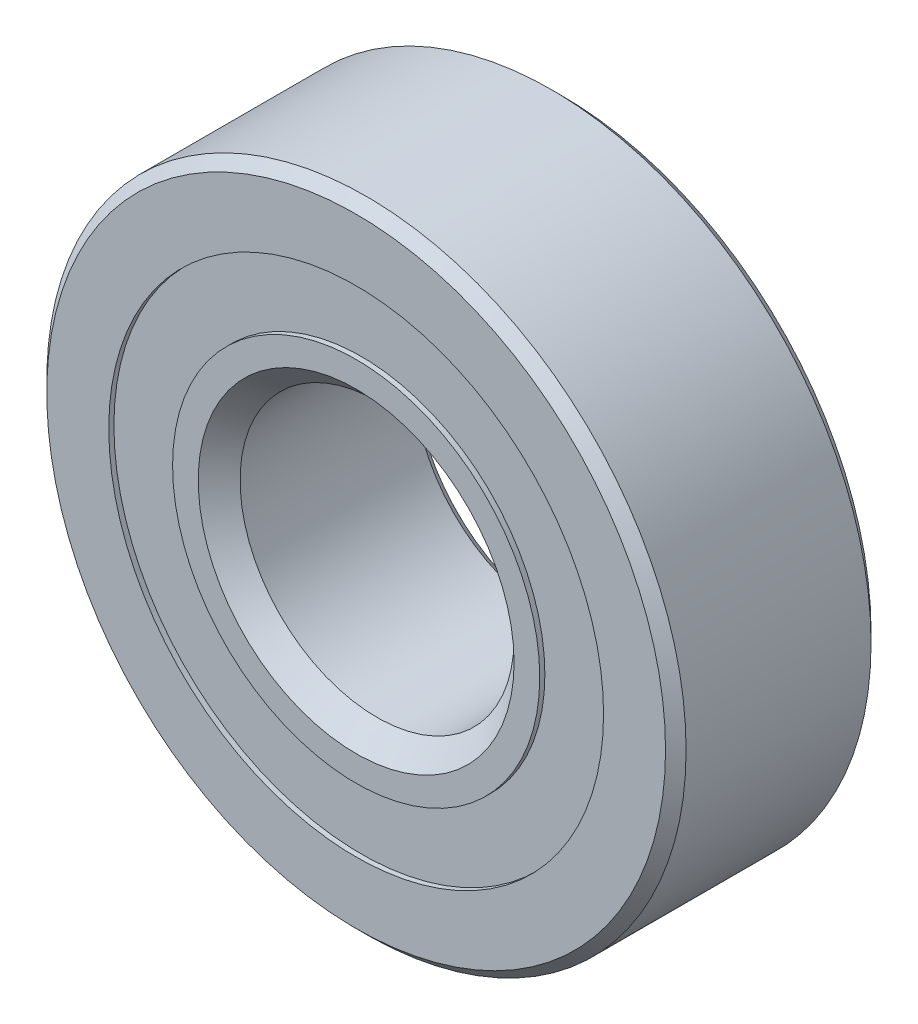
ISO-10303-21;
HEADER;
FILE_DESCRIPTION(('STEP AP214'),'2;1');
FILE_NAME('part.step','',(''),(''),'','','');
FILE_SCHEMA(('AUTOMOTIVE_DESIGN { 1 0 10303 214 1 1 1 1 }'));
ENDSEC;
DATA;
#1=APPLICATION_CONTEXT('core data for automotive mechanical design processes');
#2=APPLICATION_PROTOCOL_DEFINITION('international standard','automotive_design',2000,#1);
#3=PRODUCT_CONTEXT('',#1,'mechanical');
#4=PRODUCT('Part','Part','',(#3));
#5=PRODUCT_RELATED_PRODUCT_CATEGORY('part','',(#4));
#6=PRODUCT_DEFINITION_FORMATION('','',#4);
#7=PRODUCT_DEFINITION_CONTEXT('part definition',#1,'design');
#8=PRODUCT_DEFINITION('design','',#6,#7);
#9=PRODUCT_DEFINITION_SHAPE('','',#8);
#10=(LENGTH_UNIT() NAMED_UNIT(*) SI_UNIT(.MILLI.,.METRE.));
#11=(NAMED_UNIT(*) PLANE_ANGLE_UNIT() SI_UNIT($,.RADIAN.));
#12=(NAMED_UNIT(*) SI_UNIT($,.STERADIAN.) SOLID_ANGLE_UNIT());
#13=UNCERTAINTY_MEASURE_WITH_UNIT(LENGTH_MEASURE(1.E-05),#10,'distance_accuracy_value','');
#14=(GEOMETRIC_REPRESENTATION_CONTEXT(3) GLOBAL_UNCERTAINTY_ASSIGNED_CONTEXT((#13)) GLOBAL_UNIT_ASSIGNED_CONTEXT((#10,
#11,#12)) REPRESENTATION_CONTEXT('',''));
#15=CARTESIAN_POINT('',(0.,0.,0.));
#16=DIRECTION('',(0.,0.,1.));
#17=DIRECTION('',(1.,0.,0.));
#18=AXIS2_PLACEMENT_3D('',#15,#16,#17);
#19=CARTESIAN_POINT('',(0.,8.60041208791209,-3.39328125));
#20=DIRECTION('',(0.,0.,1.));
#21=DIRECTION('',(1.,0.,0.));
#22=AXIS2_PLACEMENT_3D('',#19,#20,#21);
#23=PLANE('',#22);
#24=CARTESIAN_POINT('',(0.,0.,-3.39328125));
#25=DIRECTION('',(0.,0.,1.));
#26=DIRECTION('',(1.,0.,0.));
#27=AXIS2_PLACEMENT_3D('',#24,#25,#26);
#28=CIRCLE('',#27,8.60041208791209);
#29=CARTESIAN_POINT('',(8.60041208791209,0.,-3.39328125));
#30=VERTEX_POINT('',#29);
#31=EDGE_CURVE('E57',#30,#30,#28,.T.);
#32=ORIENTED_EDGE('',*,*,#31,.F.);
#33=EDGE_LOOP('',(#32));
#34=FACE_BOUND('',#33,.T.);
#35=CARTESIAN_POINT('',(0.,0.,-3.39328125));
#36=DIRECTION('',(0.,0.,1.));
#37=DIRECTION('',(1.,0.,0.));
#38=AXIS2_PLACEMENT_3D('',#35,#36,#37);
#39=CIRCLE('',#38,6.38220612444005);
#40=CARTESIAN_POINT('',(6.38220612444005,0.,-3.39328125));
#41=VERTEX_POINT('',#40);
#42=EDGE_CURVE('E11',#41,#41,#39,.T.);
#43=ORIENTED_EDGE('',*,*,#42,.T.);
#44=EDGE_LOOP('',(#43));
#45=FACE_BOUND('',#44,.T.);
#46=ADVANCED_FACE('F43',(#34,#45),#23,.F.);
#47=CARTESIAN_POINT('',(0.,0.,3.571875));
#48=DIRECTION('',(0.,0.,1.));
#49=DIRECTION('',(1.,0.,0.));
#50=AXIS2_PLACEMENT_3D('',#47,#48,#49);
#51=CYLINDRICAL_SURFACE('',#50,6.38220612444005);
#52=ORIENTED_EDGE('',*,*,#42,.F.);
#53=EDGE_LOOP('',(#52));
#54=FACE_BOUND('',#53,.T.);
#55=CARTESIAN_POINT('',(0.,0.,-1.72035132641562));
#56=DIRECTION('',(0.,0.,1.));
#57=DIRECTION('',(1.,0.,0.));
#58=AXIS2_PLACEMENT_3D('',#55,#56,#57);
#59=CIRCLE('',#58,6.38220612444005);
#60=CARTESIAN_POINT('',(6.38220612444005,0.,-1.72035132641562));
#61=VERTEX_POINT('',#60);
#62=EDGE_CURVE('E49',#61,#61,#59,.T.);
#63=ORIENTED_EDGE('',*,*,#62,.T.);
#64=EDGE_LOOP('',(#63));
#65=FACE_BOUND('',#64,.T.);
#66=ADVANCED_FACE('F66',(#54,#65),#51,.F.);
#67=CARTESIAN_POINT('',(0.,8.60041208791209,-1.72035132641562));
#68=DIRECTION('',(0.,0.,-1.));
#69=DIRECTION('',(-1.,0.,0.));
#70=AXIS2_PLACEMENT_3D('',#67,#68,#69);
#71=PLANE('',#70);
#72=ORIENTED_EDGE('',*,*,#62,.F.);
#73=EDGE_LOOP('',(#72));
#74=FACE_BOUND('',#73,.T.);
#75=CARTESIAN_POINT('',(0.,0.,-1.72035132641562));
#76=DIRECTION('',(0.,0.,1.));
#77=DIRECTION('',(1.,0.,0.));
#78=AXIS2_PLACEMENT_3D('',#75,#76,#77);
#79=CIRCLE('',#78,8.60041208791209);
#80=CARTESIAN_POINT('',(8.60041208791209,0.,-1.72035132641562));
#81=VERTEX_POINT('',#80);
#82=EDGE_CURVE('E53',#81,#81,#79,.T.);
#83=ORIENTED_EDGE('',*,*,#82,.T.);
#84=EDGE_LOOP('',(#83));
#85=FACE_BOUND('',#84,.T.);
#86=ADVANCED_FACE('F70',(#74,#85),#71,.F.);
#87=CARTESIAN_POINT('',(0.,0.,3.571875));
#88=DIRECTION('',(0.,0.,1.));
#89=DIRECTION('',(1.,0.,0.));
#90=AXIS2_PLACEMENT_3D('',#87,#88,#89);
#91=CYLINDRICAL_SURFACE('',#90,8.60041208791209);
#92=ORIENTED_EDGE('',*,*,#82,.F.);
#93=EDGE_LOOP('',(#92));
#94=FACE_BOUND('',#93,.T.);
#95=ORIENTED_EDGE('',*,*,#31,.T.);
#96=EDGE_LOOP('',(#95));
#97=FACE_BOUND('',#96,.T.);
#98=ADVANCED_FACE('F63',(#94,#97),#91,.T.);
#99=CLOSED_SHELL('',(#46,#66,#86,#98));
#100=MANIFOLD_SOLID_BREP('B2',#99);
#101=CARTESIAN_POINT('',(0.,8.60041208791209,3.39328125));
#102=DIRECTION('',(0.,0.,-1.));
#103=DIRECTION('',(-1.,0.,0.));
#104=AXIS2_PLACEMENT_3D('',#101,#102,#103);
#105=PLANE('',#104);
#106=CARTESIAN_POINT('',(0.,0.,3.39328125));
#107=DIRECTION('',(0.,0.,1.));
#108=DIRECTION('',(1.,0.,0.));
#109=AXIS2_PLACEMENT_3D('',#106,#107,#108);
#110=CIRCLE('',#109,6.38220612444005);
#111=CARTESIAN_POINT('',(6.38220612444005,0.,3.39328125));
#112=VERTEX_POINT('',#111);
#113=EDGE_CURVE('E42',#112,#112,#110,.T.);
#114=ORIENTED_EDGE('',*,*,#113,.F.);
#115=EDGE_LOOP('',(#114));
#116=FACE_BOUND('',#115,.T.);
#117=CARTESIAN_POINT('',(0.,0.,3.39328125));
#118=DIRECTION('',(0.,0.,1.));
#119=DIRECTION('',(1.,0.,0.));
#120=AXIS2_PLACEMENT_3D('',#117,#118,#119);
#121=CIRCLE('',#120,8.60041208791209);
#122=CARTESIAN_POINT('',(8.60041208791209,0.,3.39328125));
#123=VERTEX_POINT('',#122);
#124=EDGE_CURVE('E124',#123,#123,#121,.T.);
#125=ORIENTED_EDGE('',*,*,#124,.T.);
#126=EDGE_LOOP('',(#125));
#127=FACE_BOUND('',#126,.T.);
#128=ADVANCED_FACE('F110',(#116,#127),#105,.F.);
#129=CARTESIAN_POINT('',(0.,0.,3.571875));
#130=DIRECTION('',(0.,0.,1.));
#131=DIRECTION('',(1.,0.,0.));
#132=AXIS2_PLACEMENT_3D('',#129,#130,#131);
#133=CYLINDRICAL_SURFACE('',#132,6.38220612444005);
#134=CARTESIAN_POINT('',(0.,0.,1.72035132641561));
#135=DIRECTION('',(0.,0.,1.));
#136=DIRECTION('',(1.,0.,0.));
#137=AXIS2_PLACEMENT_3D('',#134,#135,#136);
#138=CIRCLE('',#137,6.38220612444005);
#139=CARTESIAN_POINT('',(6.38220612444005,0.,1.72035132641561));
#140=VERTEX_POINT('',#139);
#141=EDGE_CURVE('E116',#140,#140,#138,.T.);
#142=ORIENTED_EDGE('',*,*,#141,.F.);
#143=EDGE_LOOP('',(#142));
#144=FACE_BOUND('',#143,.T.);
#145=ORIENTED_EDGE('',*,*,#113,.T.);
#146=EDGE_LOOP('',(#145));
#147=FACE_BOUND('',#146,.T.);
#148=ADVANCED_FACE('F139',(#144,#147),#133,.F.);
#149=CARTESIAN_POINT('',(0.,8.60041208791209,1.72035132641561));
#150=DIRECTION('',(0.,0.,1.));
#151=DIRECTION('',(1.,0.,0.));
#152=AXIS2_PLACEMENT_3D('',#149,#150,#151);
#153=PLANE('',#152);
#154=CARTESIAN_POINT('',(0.,0.,1.72035132641561));
#155=DIRECTION('',(0.,0.,1.));
#156=DIRECTION('',(1.,0.,0.));
#157=AXIS2_PLACEMENT_3D('',#154,#155,#156);
#158=CIRCLE('',#157,8.60041208791209);
#159=CARTESIAN_POINT('',(8.60041208791209,0.,1.72035132641561));
#160=VERTEX_POINT('',#159);
#161=EDGE_CURVE('E120',#160,#160,#158,.T.);
#162=ORIENTED_EDGE('',*,*,#161,.F.);
#163=EDGE_LOOP('',(#162));
#164=FACE_BOUND('',#163,.T.);
#165=ORIENTED_EDGE('',*,*,#141,.T.);
#166=EDGE_LOOP('',(#165));
#167=FACE_BOUND('',#166,.T.);
#168=ADVANCED_FACE('F134',(#164,#167),#153,.F.);
#169=CARTESIAN_POINT('',(0.,0.,3.571875));
#170=DIRECTION('',(0.,0.,1.));
#171=DIRECTION('',(1.,0.,0.));
#172=AXIS2_PLACEMENT_3D('',#169,#170,#171);
#173=CYLINDRICAL_SURFACE('',#172,8.60041208791209);
#174=ORIENTED_EDGE('',*,*,#124,.F.);
#175=EDGE_LOOP('',(#174));
#176=FACE_BOUND('',#175,.T.);
#177=ORIENTED_EDGE('',*,*,#161,.T.);
#178=EDGE_LOOP('',(#177));
#179=FACE_BOUND('',#178,.T.);
#180=ADVANCED_FACE('F131',(#176,#179),#173,.T.);
#181=CLOSED_SHELL('',(#128,#148,#168,#180));
#182=MANIFOLD_SOLID_BREP('B6',#181);
#183=CARTESIAN_POINT('',(-3.96874999999991,6.87407664253903,0.));
#184=DIRECTION('',(0.,0.,1.));
#185=DIRECTION('',(-0.499999999999989,0.866025403784445,0.));
#186=AXIS2_PLACEMENT_3D('',#183,#184,#185);
#187=SPHERICAL_SURFACE('',#186,1.72035132641561);
#188=CARTESIAN_POINT('',(-3.96874999999991,6.87407664253903,1.72035132641561));
#189=VERTEX_POINT('',#188);
#190=VERTEX_LOOP('',#189);
#191=FACE_BOUND('',#190,.T.);
#192=ADVANCED_FACE('F192',(#191),#187,.T.);
#193=CLOSED_SHELL('',(#192));
#194=MANIFOLD_SOLID_BREP('B37',#193);
#195=CARTESIAN_POINT('',(-6.87407664253894,3.96875000000008,0.));
#196=DIRECTION('',(0.,0.,1.));
#197=DIRECTION('',(-0.866025403784433,0.50000000000001,0.));
#198=AXIS2_PLACEMENT_3D('',#195,#196,#197);
#199=SPHERICAL_SURFACE('',#198,1.72035132641561);
#200=CARTESIAN_POINT('',(-6.87407664253894,3.96875000000008,1.72035132641561));
#201=VERTEX_POINT('',#200);
#202=VERTEX_LOOP('',#201);
#203=FACE_BOUND('',#202,.T.);
#204=ADVANCED_FACE('F225',(#203),#199,.T.);
#205=CLOSED_SHELL('',(#204));
#206=MANIFOLD_SOLID_BREP('B106',#205);
#207=CARTESIAN_POINT('',(-7.9375,0.,0.));
#208=DIRECTION('',(0.,0.,1.));
#209=DIRECTION('',(-1.,0.,0.));
#210=AXIS2_PLACEMENT_3D('',#207,#208,#209);
#211=SPHERICAL_SURFACE('',#210,1.72035132641561);
#212=CARTESIAN_POINT('',(-7.9375,0.,1.72035132641561));
#213=VERTEX_POINT('',#212);
#214=VERTEX_LOOP('',#213);
#215=FACE_BOUND('',#214,.T.);
#216=ADVANCED_FACE('F258',(#215),#211,.T.);
#217=CLOSED_SHELL('',(#216));
#218=MANIFOLD_SOLID_BREP('B188',#217);
#219=CARTESIAN_POINT('',(-6.87407664253902,-3.96874999999994,0.));
#220=DIRECTION('',(0.,0.,1.));
#221=DIRECTION('',(-0.866025403784443,-0.499999999999992,0.));
#222=AXIS2_PLACEMENT_3D('',#219,#220,#221);
#223=SPHERICAL_SURFACE('',#222,1.72035132641561);
#224=CARTESIAN_POINT('',(-6.87407664253902,-3.96874999999994,1.72035132641561));
#225=VERTEX_POINT('',#224);
#226=VERTEX_LOOP('',#225);
#227=FACE_BOUND('',#226,.T.);
#228=ADVANCED_FACE('F291',(#227),#223,.T.);
#229=CLOSED_SHELL('',(#228));
#230=MANIFOLD_SOLID_BREP('B221',#229);
#231=CARTESIAN_POINT('',(-3.96875000000006,-6.87407664253895,0.));
#232=DIRECTION('',(0.,0.,1.));
#233=DIRECTION('',(-0.500000000000007,-0.866025403784435,0.));
#234=AXIS2_PLACEMENT_3D('',#231,#232,#233);
#235=SPHERICAL_SURFACE('',#234,1.72035132641561);
#236=CARTESIAN_POINT('',(-3.96875000000006,-6.87407664253895,1.72035132641561));
#237=VERTEX_POINT('',#236);
#238=VERTEX_LOOP('',#237);
#239=FACE_BOUND('',#238,.T.);
#240=ADVANCED_FACE('F324',(#239),#235,.T.);
#241=CLOSED_SHELL('',(#240));
#242=MANIFOLD_SOLID_BREP('B254',#241);
#243=CARTESIAN_POINT('',(0.,-7.9375,0.));
#244=DIRECTION('',(0.,0.,1.));
#245=DIRECTION('',(0.,-1.,0.));
#246=AXIS2_PLACEMENT_3D('',#243,#244,#245);
#247=SPHERICAL_SURFACE('',#246,1.72035132641561);
#248=CARTESIAN_POINT('',(0.,-7.9375,1.72035132641561));
#249=VERTEX_POINT('',#248);
#250=VERTEX_LOOP('',#249);
#251=FACE_BOUND('',#250,.T.);
#252=ADVANCED_FACE('F357',(#251),#247,.T.);
#253=CLOSED_SHELL('',(#252));
#254=MANIFOLD_SOLID_BREP('B287',#253);
#255=CARTESIAN_POINT('',(3.96874999999996,-6.87407664253901,0.));
#256=DIRECTION('',(0.,0.,1.));
#257=DIRECTION('',(0.499999999999995,-0.866025403784442,0.));
#258=AXIS2_PLACEMENT_3D('',#255,#256,#257);
#259=SPHERICAL_SURFACE('',#258,1.72035132641561);
#260=CARTESIAN_POINT('',(3.96874999999996,-6.87407664253901,1.72035132641561));
#261=VERTEX_POINT('',#260);
#262=VERTEX_LOOP('',#261);
#263=FACE_BOUND('',#262,.T.);
#264=ADVANCED_FACE('F390',(#263),#259,.T.);
#265=CLOSED_SHELL('',(#264));
#266=MANIFOLD_SOLID_BREP('B320',#265);
#267=CARTESIAN_POINT('',(6.87407664253896,-3.96875000000003,0.));
#268=DIRECTION('',(0.,0.,1.));
#269=DIRECTION('',(0.866025403784436,-0.500000000000004,0.));
#270=AXIS2_PLACEMENT_3D('',#267,#268,#269);
#271=SPHERICAL_SURFACE('',#270,1.72035132641561);
#272=CARTESIAN_POINT('',(6.87407664253896,-3.96875000000003,1.72035132641561));
#273=VERTEX_POINT('',#272);
#274=VERTEX_LOOP('',#273);
#275=FACE_BOUND('',#274,.T.);
#276=ADVANCED_FACE('F423',(#275),#271,.T.);
#277=CLOSED_SHELL('',(#276));
#278=MANIFOLD_SOLID_BREP('B353',#277);
#279=CARTESIAN_POINT('',(7.9375,0.,0.));
#280=DIRECTION('',(0.,0.,1.));
#281=DIRECTION('',(1.,0.,0.));
#282=AXIS2_PLACEMENT_3D('',#279,#280,#281);
#283=SPHERICAL_SURFACE('',#282,1.72035132641561);
#284=CARTESIAN_POINT('',(7.9375,0.,1.72035132641561));
#285=VERTEX_POINT('',#284);
#286=VERTEX_LOOP('',#285);
#287=FACE_BOUND('',#286,.T.);
#288=ADVANCED_FACE('F456',(#287),#283,.T.);
#289=CLOSED_SHELL('',(#288));
#290=MANIFOLD_SOLID_BREP('B386',#289);
#291=CARTESIAN_POINT('',(6.87407664253899,3.96874999999998,0.));
#292=DIRECTION('',(0.,0.,1.));
#293=DIRECTION('',(0.86602540378444,0.499999999999998,0.));
#294=AXIS2_PLACEMENT_3D('',#291,#292,#293);
#295=SPHERICAL_SURFACE('',#294,1.72035132641561);
#296=CARTESIAN_POINT('',(6.87407664253899,3.96874999999998,1.72035132641561));
#297=VERTEX_POINT('',#296);
#298=VERTEX_LOOP('',#297);
#299=FACE_BOUND('',#298,.T.);
#300=ADVANCED_FACE('F489',(#299),#295,.T.);
#301=CLOSED_SHELL('',(#300));
#302=MANIFOLD_SOLID_BREP('B419',#301);
#303=CARTESIAN_POINT('',(3.96875000000001,6.87407664253898,0.));
#304=DIRECTION('',(0.,0.,1.));
#305=DIRECTION('',(0.500000000000001,0.866025403784438,0.));
#306=AXIS2_PLACEMENT_3D('',#303,#304,#305);
#307=SPHERICAL_SURFACE('',#306,1.72035132641561);
#308=CARTESIAN_POINT('',(3.96875000000001,6.87407664253898,1.72035132641561));
#309=VERTEX_POINT('',#308);
#310=VERTEX_LOOP('',#309);
#311=FACE_BOUND('',#310,.T.);
#312=ADVANCED_FACE('F522',(#311),#307,.T.);
#313=CLOSED_SHELL('',(#312));
#314=MANIFOLD_SOLID_BREP('B452',#313);
#315=CARTESIAN_POINT('',(0.,7.9375,0.));
#316=DIRECTION('',(0.,0.,1.));
#317=DIRECTION('',(0.,1.,0.));
#318=AXIS2_PLACEMENT_3D('',#315,#316,#317);
#319=SPHERICAL_SURFACE('',#318,1.72035132641561);
#320=CARTESIAN_POINT('',(0.,7.9375,1.72035132641561));
#321=VERTEX_POINT('',#320);
#322=VERTEX_LOOP('',#321);
#323=FACE_BOUND('',#322,.T.);
#324=ADVANCED_FACE('F557',(#323),#319,.T.);
#325=CLOSED_SHELL('',(#324));
#326=MANIFOLD_SOLID_BREP('B485',#325);
#327=CARTESIAN_POINT('',(0.,0.,3.571875));
#328=DIRECTION('',(0.,0.,1.));
#329=DIRECTION('',(1.,0.,0.));
#330=AXIS2_PLACEMENT_3D('',#327,#328,#329);
#331=CYLINDRICAL_SURFACE('',#330,6.38220612444005);
#332=CARTESIAN_POINT('',(0.,0.,3.571875));
#333=DIRECTION('',(0.,0.,1.));
#334=DIRECTION('',(1.,0.,0.));
#335=AXIS2_PLACEMENT_3D('',#332,#333,#334);
#336=CIRCLE('',#335,6.38220612444005);
#337=CARTESIAN_POINT('',(6.38220612444005,0.,3.571875));
#338=VERTEX_POINT('',#337);
#339=EDGE_CURVE('E616',#338,#338,#336,.T.);
#340=ORIENTED_EDGE('',*,*,#339,.F.);
#341=EDGE_LOOP('',(#340));
#342=FACE_BOUND('',#341,.T.);
#343=CARTESIAN_POINT('',(0.,0.,3.39328125));
#344=DIRECTION('',(0.,0.,1.));
#345=DIRECTION('',(1.,0.,0.));
#346=AXIS2_PLACEMENT_3D('',#343,#344,#345);
#347=CIRCLE('',#346,6.38220612444005);
#348=CARTESIAN_POINT('',(6.38220612444005,0.,3.39328125));
#349=VERTEX_POINT('',#348);
#350=EDGE_CURVE('E556',#349,#349,#347,.T.);
#351=ORIENTED_EDGE('',*,*,#350,.T.);
#352=EDGE_LOOP('',(#351));
#353=FACE_BOUND('',#352,.T.);
#354=ADVANCED_FACE('F576',(#342,#353),#331,.T.);
#355=CARTESIAN_POINT('',(0.,6.38220612444005,3.39328125));
#356=DIRECTION('',(0.,0.,1.));
#357=DIRECTION('',(1.,0.,0.));
#358=AXIS2_PLACEMENT_3D('',#355,#356,#357);
#359=PLANE('',#358);
#360=ORIENTED_EDGE('',*,*,#350,.F.);
#361=EDGE_LOOP('',(#360));
#362=FACE_BOUND('',#361,.T.);
#363=CARTESIAN_POINT('',(0.,0.,3.39328125));
#364=DIRECTION('',(0.,0.,1.));
#365=DIRECTION('',(1.,0.,0.));
#366=AXIS2_PLACEMENT_3D('',#363,#364,#365);
#367=CIRCLE('',#366,6.20361237444005);
#368=CARTESIAN_POINT('',(6.20361237444005,0.,3.39328125));
#369=VERTEX_POINT('',#368);
#370=EDGE_CURVE('E582',#369,#369,#367,.T.);
#371=ORIENTED_EDGE('',*,*,#370,.T.);
#372=EDGE_LOOP('',(#371));
#373=FACE_BOUND('',#372,.T.);
#374=ADVANCED_FACE('F623',(#362,#373),#359,.F.);
#375=CARTESIAN_POINT('',(0.,0.,2.67949321235215));
#376=DIRECTION('',(0.,0.,1.));
#377=DIRECTION('',(1.,0.,0.));
#378=AXIS2_PLACEMENT_3D('',#375,#376,#377);
#379=CONICAL_SURFACE('',#378,5.48982433679219,0.78539816339745);
#380=ORIENTED_EDGE('',*,*,#370,.F.);
#381=EDGE_LOOP('',(#380));
#382=FACE_BOUND('',#381,.T.);
#383=CARTESIAN_POINT('',(0.,0.,2.67949321235215));
#384=DIRECTION('',(0.,0.,1.));
#385=DIRECTION('',(1.,0.,0.));
#386=AXIS2_PLACEMENT_3D('',#383,#384,#385);
#387=CIRCLE('',#386,5.48982433679219);
#388=CARTESIAN_POINT('',(5.48982433679219,0.,2.67949321235215));
#389=VERTEX_POINT('',#388);
#390=EDGE_CURVE('E586',#389,#389,#387,.T.);
#391=ORIENTED_EDGE('',*,*,#390,.T.);
#392=EDGE_LOOP('',(#391));
#393=FACE_BOUND('',#392,.T.);
#394=ADVANCED_FACE('F627',(#382,#393),#379,.T.);
#395=CARTESIAN_POINT('',(0.,0.,3.571875));
#396=DIRECTION('',(0.,0.,1.));
#397=DIRECTION('',(1.,0.,0.));
#398=AXIS2_PLACEMENT_3D('',#395,#396,#397);
#399=CYLINDRICAL_SURFACE('',#398,5.48982433679219);
#400=ORIENTED_EDGE('',*,*,#390,.F.);
#401=EDGE_LOOP('',(#400));
#402=FACE_BOUND('',#401,.T.);
#403=CARTESIAN_POINT('',(0.,0.,0.));
#404=DIRECTION('',(0.,0.,1.));
#405=DIRECTION('',(1.,0.,0.));
#406=AXIS2_PLACEMENT_3D('',#403,#404,#405);
#407=CIRCLE('',#406,5.48982433679219);
#408=CARTESIAN_POINT('',(5.48982433679219,0.,0.));
#409=VERTEX_POINT('',#408);
#410=EDGE_CURVE('E590',#409,#409,#407,.T.);
#411=ORIENTED_EDGE('',*,*,#410,.T.);
#412=EDGE_LOOP('',(#411));
#413=FACE_BOUND('',#412,.T.);
#414=ADVANCED_FACE('F632',(#402,#413),#399,.T.);
#415=CARTESIAN_POINT('',(0.,5.48982433679219,0.));
#416=DIRECTION('',(0.,0.,-1.));
#417=DIRECTION('',(-1.,0.,0.));
#418=AXIS2_PLACEMENT_3D('',#415,#416,#417);
#419=PLANE('',#418);
#420=ORIENTED_EDGE('',*,*,#410,.F.);
#421=EDGE_LOOP('',(#420));
#422=FACE_BOUND('',#421,.T.);
#423=CARTESIAN_POINT('',(0.,0.,0.));
#424=DIRECTION('',(0.,0.,1.));
#425=DIRECTION('',(1.,0.,0.));
#426=AXIS2_PLACEMENT_3D('',#423,#424,#425);
#427=CIRCLE('',#426,6.21714867358439);
#428=CARTESIAN_POINT('',(6.21714867358439,0.,0.));
#429=VERTEX_POINT('',#428);
#430=EDGE_CURVE('E595',#429,#429,#427,.T.);
#431=ORIENTED_EDGE('',*,*,#430,.T.);
#432=EDGE_LOOP('',(#431));
#433=FACE_BOUND('',#432,.T.);
#434=ADVANCED_FACE('F638',(#422,#433),#419,.F.);
#435=CARTESIAN_POINT('',(0.,0.,0.));
#436=DIRECTION('',(0.,0.,1.));
#437=DIRECTION('',(1.,0.,0.));
#438=AXIS2_PLACEMENT_3D('',#435,#436,#437);
#439=TOROIDAL_SURFACE('',#438,7.9375,1.72035132641561);
#440=ORIENTED_EDGE('',*,*,#430,.F.);
#441=EDGE_LOOP('',(#440));
#442=FACE_BOUND('',#441,.T.);
#443=CARTESIAN_POINT('',(0.,0.,-1.5875));
#444=DIRECTION('',(0.,0.,1.));
#445=DIRECTION('',(1.,0.,0.));
#446=AXIS2_PLACEMENT_3D('',#443,#444,#445);
#447=CIRCLE('',#446,7.27458791208791);
#448=CARTESIAN_POINT('',(7.27458791208791,0.,-1.5875));
#449=VERTEX_POINT('',#448);
#450=EDGE_CURVE('E598',#449,#449,#447,.T.);
#451=ORIENTED_EDGE('',*,*,#450,.T.);
#452=EDGE_LOOP('',(#451));
#453=FACE_BOUND('',#452,.T.);
#454=ADVANCED_FACE('F642',(#442,#453),#439,.F.);
#455=CARTESIAN_POINT('',(0.,0.,3.571875));
#456=DIRECTION('',(0.,0.,1.));
#457=DIRECTION('',(1.,0.,0.));
#458=AXIS2_PLACEMENT_3D('',#455,#456,#457);
#459=CYLINDRICAL_SURFACE('',#458,7.27458791208791);
#460=ORIENTED_EDGE('',*,*,#450,.F.);
#461=EDGE_LOOP('',(#460));
#462=FACE_BOUND('',#461,.T.);
#463=CARTESIAN_POINT('',(0.,0.,-3.571875));
#464=DIRECTION('',(0.,0.,1.));
#465=DIRECTION('',(1.,0.,0.));
#466=AXIS2_PLACEMENT_3D('',#463,#464,#465);
#467=CIRCLE('',#466,7.27458791208791);
#468=CARTESIAN_POINT('',(7.27458791208791,0.,-3.571875));
#469=VERTEX_POINT('',#468);
#470=EDGE_CURVE('E601',#469,#469,#467,.T.);
#471=ORIENTED_EDGE('',*,*,#470,.T.);
#472=EDGE_LOOP('',(#471));
#473=FACE_BOUND('',#472,.T.);
#474=ADVANCED_FACE('F646',(#462,#473),#459,.T.);
#475=CARTESIAN_POINT('',(0.,5.1196875,-3.571875));
#476=DIRECTION('',(0.,0.,1.));
#477=DIRECTION('',(1.,0.,0.));
#478=AXIS2_PLACEMENT_3D('',#475,#476,#477);
#479=PLANE('',#478);
#480=ORIENTED_EDGE('',*,*,#470,.F.);
#481=EDGE_LOOP('',(#480));
#482=FACE_BOUND('',#481,.T.);
#483=CARTESIAN_POINT('',(0.,0.,-3.571875));
#484=DIRECTION('',(0.,0.,1.));
#485=DIRECTION('',(1.,0.,0.));
#486=AXIS2_PLACEMENT_3D('',#483,#484,#485);
#487=CIRCLE('',#486,5.1196875);
#488=CARTESIAN_POINT('',(5.1196875,0.,-3.571875));
#489=VERTEX_POINT('',#488);
#490=EDGE_CURVE('E604',#489,#489,#487,.T.);
#491=ORIENTED_EDGE('',*,*,#490,.T.);
#492=EDGE_LOOP('',(#491));
#493=FACE_BOUND('',#492,.T.);
#494=ADVANCED_FACE('F650',(#482,#493),#479,.F.);
#495=CARTESIAN_POINT('',(0.,0.,-3.2146875));
#496=DIRECTION('',(0.,0.,-1.));
#497=DIRECTION('',(-1.,0.,0.));
#498=AXIS2_PLACEMENT_3D('',#495,#496,#497);
#499=CONICAL_SURFACE('',#498,4.7625,0.78539816339745);
#500=ORIENTED_EDGE('',*,*,#490,.F.);
#501=EDGE_LOOP('',(#500));
#502=FACE_BOUND('',#501,.T.);
#503=CARTESIAN_POINT('',(0.,0.,-3.2146875));
#504=DIRECTION('',(0.,0.,1.));
#505=DIRECTION('',(1.,0.,0.));
#506=AXIS2_PLACEMENT_3D('',#503,#504,#505);
#507=CIRCLE('',#506,4.7625);
#508=CARTESIAN_POINT('',(4.7625,0.,-3.2146875));
#509=VERTEX_POINT('',#508);
#510=EDGE_CURVE('E607',#509,#509,#507,.T.);
#511=ORIENTED_EDGE('',*,*,#510,.T.);
#512=EDGE_LOOP('',(#511));
#513=FACE_BOUND('',#512,.T.);
#514=ADVANCED_FACE('F654',(#502,#513),#499,.F.);
#515=CARTESIAN_POINT('',(0.,0.,3.571875));
#516=DIRECTION('',(0.,0.,1.));
#517=DIRECTION('',(1.,0.,0.));
#518=AXIS2_PLACEMENT_3D('',#515,#516,#517);
#519=CYLINDRICAL_SURFACE('',#518,4.7625);
#520=ORIENTED_EDGE('',*,*,#510,.F.);
#521=EDGE_LOOP('',(#520));
#522=FACE_BOUND('',#521,.T.);
#523=CARTESIAN_POINT('',(0.,0.,2.84455066320781));
#524=DIRECTION('',(0.,0.,1.));
#525=DIRECTION('',(1.,0.,0.));
#526=AXIS2_PLACEMENT_3D('',#523,#524,#525);
#527=CIRCLE('',#526,4.7625);
#528=CARTESIAN_POINT('',(4.7625,0.,2.84455066320781));
#529=VERTEX_POINT('',#528);
#530=EDGE_CURVE('E610',#529,#529,#527,.T.);
#531=ORIENTED_EDGE('',*,*,#530,.T.);
#532=EDGE_LOOP('',(#531));
#533=FACE_BOUND('',#532,.T.);
#534=ADVANCED_FACE('F658',(#522,#533),#519,.F.);
#535=CARTESIAN_POINT('',(0.,0.,3.571875));
#536=DIRECTION('',(0.,0.,1.));
#537=DIRECTION('',(1.,0.,0.));
#538=AXIS2_PLACEMENT_3D('',#535,#536,#537);
#539=CONICAL_SURFACE('',#538,5.48982433679219,0.785398163397451);
#540=ORIENTED_EDGE('',*,*,#530,.F.);
#541=EDGE_LOOP('',(#540));
#542=FACE_BOUND('',#541,.T.);
#543=CARTESIAN_POINT('',(0.,0.,3.571875));
#544=DIRECTION('',(0.,0.,1.));
#545=DIRECTION('',(1.,0.,0.));
#546=AXIS2_PLACEMENT_3D('',#543,#544,#545);
#547=CIRCLE('',#546,5.48982433679219);
#548=CARTESIAN_POINT('',(5.48982433679219,0.,3.571875));
#549=VERTEX_POINT('',#548);
#550=EDGE_CURVE('E613',#549,#549,#547,.T.);
#551=ORIENTED_EDGE('',*,*,#550,.T.);
#552=EDGE_LOOP('',(#551));
#553=FACE_BOUND('',#552,.T.);
#554=ADVANCED_FACE('F662',(#542,#553),#539,.F.);
#555=CARTESIAN_POINT('',(0.,6.38220612444005,3.571875));
#556=DIRECTION('',(0.,0.,-1.));
#557=DIRECTION('',(-1.,0.,0.));
#558=AXIS2_PLACEMENT_3D('',#555,#556,#557);
#559=PLANE('',#558);
#560=ORIENTED_EDGE('',*,*,#550,.F.);
#561=EDGE_LOOP('',(#560));
#562=FACE_BOUND('',#561,.T.);
#563=ORIENTED_EDGE('',*,*,#339,.T.);
#564=EDGE_LOOP('',(#563));
#565=FACE_BOUND('',#564,.T.);
#566=ADVANCED_FACE('F620',(#562,#565),#559,.F.);
#567=CLOSED_SHELL('',(#354,#374,#394,#414,#434,#454,#474,#494,#514,#534,#554,#566));
#568=MANIFOLD_SOLID_BREP('B518',#567);
#569=CARTESIAN_POINT('',(0.,0.,3.2146875));
#570=DIRECTION('',(0.,0.,-1.));
#571=DIRECTION('',(-1.,0.,0.));
#572=AXIS2_PLACEMENT_3D('',#569,#570,#571);
#573=CONICAL_SURFACE('',#572,11.1125,0.785398163397448);
#574=CARTESIAN_POINT('',(0.,0.,3.571875));
#575=DIRECTION('',(0.,0.,1.));
#576=DIRECTION('',(1.,0.,0.));
#577=AXIS2_PLACEMENT_3D('',#574,#575,#576);
#578=CIRCLE('',#577,10.7553125);
#579=CARTESIAN_POINT('',(10.7553125,0.,3.571875));
#580=VERTEX_POINT('',#579);
#581=EDGE_CURVE('E785',#580,#580,#578,.T.);
#582=ORIENTED_EDGE('',*,*,#581,.F.);
#583=EDGE_LOOP('',(#582));
#584=FACE_BOUND('',#583,.T.);
#585=CARTESIAN_POINT('',(0.,0.,3.2146875));
#586=DIRECTION('',(0.,0.,1.));
#587=DIRECTION('',(1.,0.,0.));
#588=AXIS2_PLACEMENT_3D('',#585,#586,#587);
#589=CIRCLE('',#588,11.1125);
#590=CARTESIAN_POINT('',(11.1125,0.,3.2146875));
#591=VERTEX_POINT('',#590);
#592=EDGE_CURVE('E575',#591,#591,#589,.T.);
#593=ORIENTED_EDGE('',*,*,#592,.T.);
#594=EDGE_LOOP('',(#593));
#595=FACE_BOUND('',#594,.T.);
#596=ADVANCED_FACE('F757',(#584,#595),#573,.T.);
#597=CARTESIAN_POINT('',(0.,0.,3.571875));
#598=DIRECTION('',(0.,0.,1.));
#599=DIRECTION('',(1.,0.,0.));
#600=AXIS2_PLACEMENT_3D('',#597,#598,#599);
#601=CYLINDRICAL_SURFACE('',#600,11.1125);
#602=ORIENTED_EDGE('',*,*,#592,.F.);
#603=EDGE_LOOP('',(#602));
#604=FACE_BOUND('',#603,.T.);
#605=CARTESIAN_POINT('',(0.,0.,-3.2146875));
#606=DIRECTION('',(0.,0.,1.));
#607=DIRECTION('',(1.,0.,0.));
#608=AXIS2_PLACEMENT_3D('',#605,#606,#607);
#609=CIRCLE('',#608,11.1125);
#610=CARTESIAN_POINT('',(11.1125,0.,-3.2146875));
#611=VERTEX_POINT('',#610);
#612=EDGE_CURVE('E763',#611,#611,#609,.T.);
#613=ORIENTED_EDGE('',*,*,#612,.T.);
#614=EDGE_LOOP('',(#613));
#615=FACE_BOUND('',#614,.T.);
#616=ADVANCED_FACE('F792',(#604,#615),#601,.T.);
#617=CARTESIAN_POINT('',(0.,0.,-3.571875));
#618=DIRECTION('',(0.,0.,1.));
#619=DIRECTION('',(1.,0.,0.));
#620=AXIS2_PLACEMENT_3D('',#617,#618,#619);
#621=CONICAL_SURFACE('',#620,10.7553125,0.785398163397446);
#622=ORIENTED_EDGE('',*,*,#612,.F.);
#623=EDGE_LOOP('',(#622));
#624=FACE_BOUND('',#623,.T.);
#625=CARTESIAN_POINT('',(0.,0.,-3.571875));
#626=DIRECTION('',(0.,0.,1.));
#627=DIRECTION('',(1.,0.,0.));
#628=AXIS2_PLACEMENT_3D('',#625,#626,#627);
#629=CIRCLE('',#628,10.7553125);
#630=CARTESIAN_POINT('',(10.7553125,0.,-3.571875));
#631=VERTEX_POINT('',#630);
#632=EDGE_CURVE('E767',#631,#631,#629,.T.);
#633=ORIENTED_EDGE('',*,*,#632,.T.);
#634=EDGE_LOOP('',(#633));
#635=FACE_BOUND('',#634,.T.);
#636=ADVANCED_FACE('F796',(#624,#635),#621,.T.);
#637=CARTESIAN_POINT('',(0.,10.7553125,-3.571875));
#638=DIRECTION('',(0.,0.,1.));
#639=DIRECTION('',(1.,0.,0.));
#640=AXIS2_PLACEMENT_3D('',#637,#638,#639);
#641=PLANE('',#640);
#642=ORIENTED_EDGE('',*,*,#632,.F.);
#643=EDGE_LOOP('',(#642));
#644=FACE_BOUND('',#643,.T.);
#645=CARTESIAN_POINT('',(0.,0.,-3.571875));
#646=DIRECTION('',(0.,0.,1.));
#647=DIRECTION('',(1.,0.,0.));
#648=AXIS2_PLACEMENT_3D('',#645,#646,#647);
#649=CIRCLE('',#648,8.60041208791209);
#650=CARTESIAN_POINT('',(8.60041208791209,0.,-3.571875));
#651=VERTEX_POINT('',#650);
#652=EDGE_CURVE('E771',#651,#651,#649,.T.);
#653=ORIENTED_EDGE('',*,*,#652,.T.);
#654=EDGE_LOOP('',(#653));
#655=FACE_BOUND('',#654,.T.);
#656=ADVANCED_FACE('F801',(#644,#655),#641,.F.);
#657=CARTESIAN_POINT('',(0.,0.,3.571875));
#658=DIRECTION('',(0.,0.,1.));
#659=DIRECTION('',(1.,0.,0.));
#660=AXIS2_PLACEMENT_3D('',#657,#658,#659);
#661=CYLINDRICAL_SURFACE('',#660,8.60041208791209);
#662=ORIENTED_EDGE('',*,*,#652,.F.);
#663=EDGE_LOOP('',(#662));
#664=FACE_BOUND('',#663,.T.);
#665=CARTESIAN_POINT('',(0.,0.,-1.5875));
#666=DIRECTION('',(0.,0.,1.));
#667=DIRECTION('',(1.,0.,0.));
#668=AXIS2_PLACEMENT_3D('',#665,#666,#667);
#669=CIRCLE('',#668,8.60041208791209);
#670=CARTESIAN_POINT('',(8.60041208791209,0.,-1.5875));
#671=VERTEX_POINT('',#670);
#672=EDGE_CURVE('E776',#671,#671,#669,.T.);
#673=ORIENTED_EDGE('',*,*,#672,.T.);
#674=EDGE_LOOP('',(#673));
#675=FACE_BOUND('',#674,.T.);
#676=ADVANCED_FACE('F807',(#664,#675),#661,.F.);
#677=CARTESIAN_POINT('',(0.,0.,0.));
#678=DIRECTION('',(0.,0.,1.));
#679=DIRECTION('',(1.,0.,0.));
#680=AXIS2_PLACEMENT_3D('',#677,#678,#679);
#681=TOROIDAL_SURFACE('',#680,7.9375,1.72035132641561);
#682=ORIENTED_EDGE('',*,*,#672,.F.);
#683=EDGE_LOOP('',(#682));
#684=FACE_BOUND('',#683,.T.);
#685=CARTESIAN_POINT('',(0.,0.,1.5875));
#686=DIRECTION('',(0.,0.,1.));
#687=DIRECTION('',(1.,0.,0.));
#688=AXIS2_PLACEMENT_3D('',#685,#686,#687);
#689=CIRCLE('',#688,8.60041208791209);
#690=CARTESIAN_POINT('',(8.60041208791209,0.,1.5875));
#691=VERTEX_POINT('',#690);
#692=EDGE_CURVE('E779',#691,#691,#689,.T.);
#693=ORIENTED_EDGE('',*,*,#692,.T.);
#694=EDGE_LOOP('',(#693));
#695=FACE_BOUND('',#694,.T.);
#696=ADVANCED_FACE('F811',(#684,#695),#681,.F.);
#697=CARTESIAN_POINT('',(0.,0.,3.571875));
#698=DIRECTION('',(0.,0.,1.));
#699=DIRECTION('',(1.,0.,0.));
#700=AXIS2_PLACEMENT_3D('',#697,#698,#699);
#701=CYLINDRICAL_SURFACE('',#700,8.60041208791209);
#702=ORIENTED_EDGE('',*,*,#692,.F.);
#703=EDGE_LOOP('',(#702));
#704=FACE_BOUND('',#703,.T.);
#705=CARTESIAN_POINT('',(0.,0.,3.571875));
#706=DIRECTION('',(0.,0.,1.));
#707=DIRECTION('',(1.,0.,0.));
#708=AXIS2_PLACEMENT_3D('',#705,#706,#707);
#709=CIRCLE('',#708,8.60041208791209);
#710=CARTESIAN_POINT('',(8.60041208791209,0.,3.571875));
#711=VERTEX_POINT('',#710);
#712=EDGE_CURVE('E782',#711,#711,#709,.T.);
#713=ORIENTED_EDGE('',*,*,#712,.T.);
#714=EDGE_LOOP('',(#713));
#715=FACE_BOUND('',#714,.T.);
#716=ADVANCED_FACE('F815',(#704,#715),#701,.F.);
#717=CARTESIAN_POINT('',(0.,10.7553125,3.571875));
#718=DIRECTION('',(0.,0.,-1.));
#719=DIRECTION('',(-1.,0.,0.));
#720=AXIS2_PLACEMENT_3D('',#717,#718,#719);
#721=PLANE('',#720);
#722=ORIENTED_EDGE('',*,*,#712,.F.);
#723=EDGE_LOOP('',(#722));
#724=FACE_BOUND('',#723,.T.);
#725=ORIENTED_EDGE('',*,*,#581,.T.);
#726=EDGE_LOOP('',(#725));
#727=FACE_BOUND('',#726,.T.);
#728=ADVANCED_FACE('F789',(#724,#727),#721,.F.);
#729=CLOSED_SHELL('',(#596,#616,#636,#656,#676,#696,#716,#728));
#730=MANIFOLD_SOLID_BREP('B551',#729);
#731=ADVANCED_BREP_SHAPE_REPRESENTATION('',(#18,#100,#182,#194,#206,#218,#230,#242,#254,#266,
#278,#290,#302,#314,#326,#568,#730),#14);
#732=SHAPE_DEFINITION_REPRESENTATION(#9,#731);
ENDSEC;
END-ISO-10303-21;
